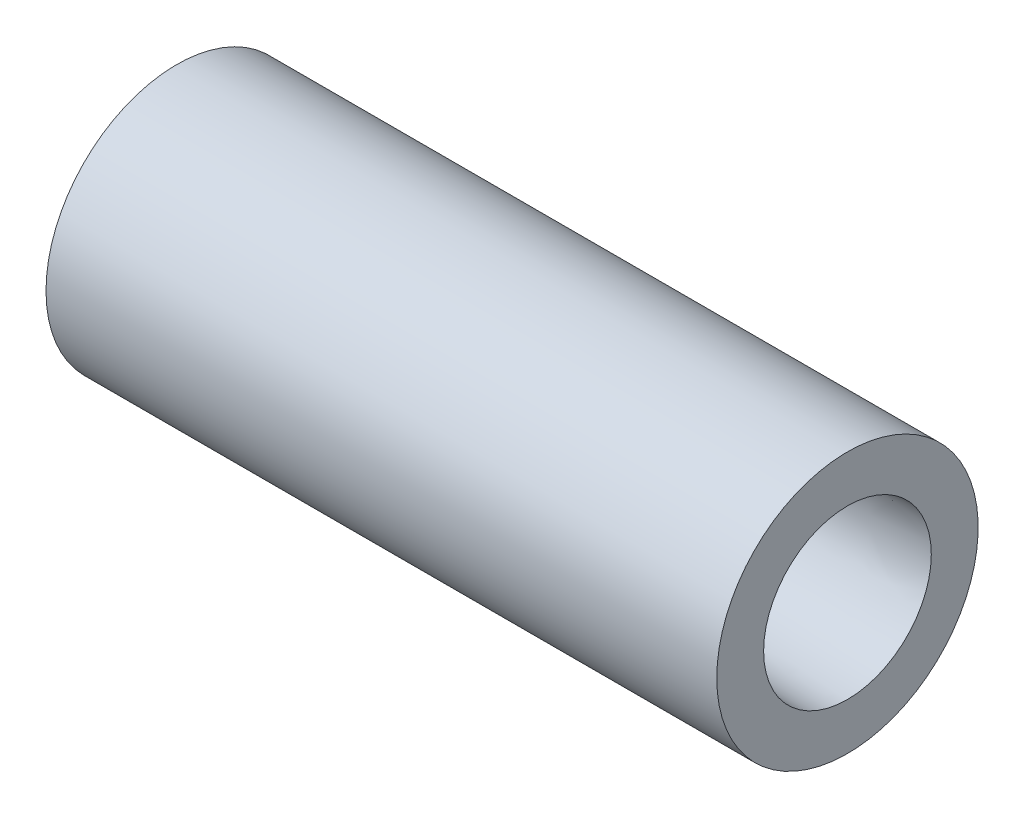
ISO-10303-21;
HEADER;
FILE_DESCRIPTION(('STEP AP214'),'2;1');
FILE_NAME('part.step','',(''),(''),'','','');
FILE_SCHEMA(('AUTOMOTIVE_DESIGN { 1 0 10303 214 1 1 1 1 }'));
ENDSEC;
DATA;
#1=APPLICATION_CONTEXT('core data for automotive mechanical design processes');
#2=APPLICATION_PROTOCOL_DEFINITION('international standard','automotive_design',2000,#1);
#3=PRODUCT_CONTEXT('',#1,'mechanical');
#4=PRODUCT('Part','Part','',(#3));
#5=PRODUCT_RELATED_PRODUCT_CATEGORY('part','',(#4));
#6=PRODUCT_DEFINITION_FORMATION('','',#4);
#7=PRODUCT_DEFINITION_CONTEXT('part definition',#1,'design');
#8=PRODUCT_DEFINITION('design','',#6,#7);
#9=PRODUCT_DEFINITION_SHAPE('','',#8);
#10=(LENGTH_UNIT() NAMED_UNIT(*) SI_UNIT(.MILLI.,.METRE.));
#11=(NAMED_UNIT(*) PLANE_ANGLE_UNIT() SI_UNIT($,.RADIAN.));
#12=(NAMED_UNIT(*) SI_UNIT($,.STERADIAN.) SOLID_ANGLE_UNIT());
#13=UNCERTAINTY_MEASURE_WITH_UNIT(LENGTH_MEASURE(1.E-05),#10,'distance_accuracy_value','');
#14=(GEOMETRIC_REPRESENTATION_CONTEXT(3) GLOBAL_UNCERTAINTY_ASSIGNED_CONTEXT((#13)) GLOBAL_UNIT_ASSIGNED_CONTEXT((#10,
#11,#12)) REPRESENTATION_CONTEXT('',''));
#15=CARTESIAN_POINT('',(0.,0.,0.));
#16=DIRECTION('',(0.,0.,1.));
#17=DIRECTION('',(1.,0.,0.));
#18=AXIS2_PLACEMENT_3D('',#15,#16,#17);
#19=CARTESIAN_POINT('',(0.,3.57919492866018,0.));
#20=CARTESIAN_POINT('',(0.892455539825838,3.54828447571399,0.));
#21=CARTESIAN_POINT('',(1.7895974646655,3.57919492867174,0.));
#22=CARTESIAN_POINT('',(2.01399854817555,3.58692652491472,0.));
#23=CARTESIAN_POINT('',(2.23832509892343,3.59658170438057,0.));
#24=CARTESIAN_POINT('',(2.46228028572995,3.60622090006969,0.));
#25=CARTESIAN_POINT('',(2.68688793006578,3.61010023682081,0.));
#26=CARTESIAN_POINT('',(3.19889941405274,3.61894350202977,0.));
#27=CARTESIAN_POINT('',(3.57919492860086,3.57919492866638,0.));
#28=B_SPLINE_CURVE_WITH_KNOTS('',2,(#19,#20,#21,#22,#23,#24,#25,#26,#27),.UNSPECIFIED.,.F.,.F.,
(3,2,2,2,3),(0.,0.5,0.625,0.75,1.),.UNSPECIFIED.);
#29=CARTESIAN_POINT('',(0.,0.,0.));
#30=DIRECTION('',(-1.,0.,0.));
#31=AXIS1_PLACEMENT('',#29,#30);
#32=SURFACE_OF_REVOLUTION('',#28,#31);
#33=CARTESIAN_POINT('',(3.57919492860086,0.,0.));
#34=DIRECTION('',(-1.,0.,0.));
#35=DIRECTION('',(0.,0.,1.));
#36=AXIS2_PLACEMENT_3D('',#33,#34,#35);
#37=CIRCLE('',#36,3.57919492866638);
#38=CARTESIAN_POINT('',(3.57919492860086,0.,3.57919492866638));
#39=VERTEX_POINT('',#38);
#40=EDGE_CURVE('E73',#39,#39,#37,.T.);
#41=ORIENTED_EDGE('',*,*,#40,.F.);
#42=EDGE_LOOP('',(#41));
#43=FACE_BOUND('',#42,.T.);
#44=CARTESIAN_POINT('',(0.,0.,0.));
#45=DIRECTION('',(-1.,0.,0.));
#46=DIRECTION('',(0.,0.,1.));
#47=AXIS2_PLACEMENT_3D('',#44,#45,#46);
#48=CIRCLE('',#47,3.57919492866018);
#49=CARTESIAN_POINT('',(0.,0.,3.57919492866018));
#50=VERTEX_POINT('',#49);
#51=EDGE_CURVE('E10',#50,#50,#48,.T.);
#52=ORIENTED_EDGE('',*,*,#51,.T.);
#53=EDGE_LOOP('',(#52));
#54=FACE_BOUND('',#53,.T.);
#55=ADVANCED_FACE('F37',(#43,#54),#32,.T.);
#56=CARTESIAN_POINT('',(0.,3.57919492866018,0.));
#57=DIRECTION('',(1.,0.,0.));
#58=DIRECTION('',(0.,0.,-1.));
#59=AXIS2_PLACEMENT_3D('',#56,#57,#58);
#60=PLANE('',#59);
#61=ORIENTED_EDGE('',*,*,#51,.F.);
#62=EDGE_LOOP('',(#61));
#63=FACE_BOUND('',#62,.T.);
#64=CARTESIAN_POINT('',(0.,0.,0.));
#65=DIRECTION('',(-1.,0.,0.));
#66=DIRECTION('',(0.,0.,1.));
#67=AXIS2_PLACEMENT_3D('',#64,#65,#66);
#68=CIRCLE('',#67,5.57919492866018);
#69=CARTESIAN_POINT('',(0.,0.,5.57919492866018));
#70=VERTEX_POINT('',#69);
#71=EDGE_CURVE('E45',#70,#70,#68,.T.);
#72=ORIENTED_EDGE('',*,*,#71,.T.);
#73=EDGE_LOOP('',(#72));
#74=FACE_BOUND('',#73,.T.);
#75=ADVANCED_FACE('F102',(#63,#74),#60,.F.);
#76=CARTESIAN_POINT('',(0.,0.,0.));
#77=DIRECTION('',(-1.,0.,0.));
#78=DIRECTION('',(0.,0.,1.));
#79=AXIS2_PLACEMENT_3D('',#76,#77,#78);
#80=CYLINDRICAL_SURFACE('',#79,5.57919492866018);
#81=ORIENTED_EDGE('',*,*,#71,.F.);
#82=EDGE_LOOP('',(#81));
#83=FACE_BOUND('',#82,.T.);
#84=CARTESIAN_POINT('',(28.6335594292815,0.,0.));
#85=DIRECTION('',(-1.,0.,0.));
#86=DIRECTION('',(0.,0.,1.));
#87=AXIS2_PLACEMENT_3D('',#84,#85,#86);
#88=CIRCLE('',#87,5.57919492866018);
#89=CARTESIAN_POINT('',(28.6335594292815,0.,5.57919492866018));
#90=VERTEX_POINT('',#89);
#91=EDGE_CURVE('E50',#90,#90,#88,.T.);
#92=ORIENTED_EDGE('',*,*,#91,.T.);
#93=EDGE_LOOP('',(#92));
#94=FACE_BOUND('',#93,.T.);
#95=ADVANCED_FACE('F99',(#83,#94),#80,.T.);
#96=CARTESIAN_POINT('',(28.6335594292815,5.57919492866018,0.));
#97=DIRECTION('',(-1.,0.,0.));
#98=DIRECTION('',(0.,0.,1.));
#99=AXIS2_PLACEMENT_3D('',#96,#97,#98);
#100=PLANE('',#99);
#101=ORIENTED_EDGE('',*,*,#91,.F.);
#102=EDGE_LOOP('',(#101));
#103=FACE_BOUND('',#102,.T.);
#104=CARTESIAN_POINT('',(28.6335594292815,0.,0.));
#105=DIRECTION('',(-1.,0.,0.));
#106=DIRECTION('',(0.,0.,1.));
#107=AXIS2_PLACEMENT_3D('',#104,#105,#106);
#108=CIRCLE('',#107,3.57919492866018);
#109=CARTESIAN_POINT('',(28.6335594292815,0.,3.57919492866018));
#110=VERTEX_POINT('',#109);
#111=EDGE_CURVE('E55',#110,#110,#108,.T.);
#112=ORIENTED_EDGE('',*,*,#111,.T.);
#113=EDGE_LOOP('',(#112));
#114=FACE_BOUND('',#113,.T.);
#115=ADVANCED_FACE('F94',(#103,#114),#100,.F.);
#116=CARTESIAN_POINT('',(17.8959746433009,2.95283581614465,0.));
#117=CARTESIAN_POINT('',(18.9726611873012,3.04911963563565,0.));
#118=CARTESIAN_POINT('',(20.5771681860868,3.16004907763778,0.));
#119=CARTESIAN_POINT('',(22.1680904906439,3.27003932613583,0.));
#120=CARTESIAN_POINT('',(23.260655716,3.33968472682989,0.));
#121=CARTESIAN_POINT('',(24.7485215325462,3.4345285023478,0.));
#122=CARTESIAN_POINT('',(25.9457474698491,3.48839129300816,0.));
#123=CARTESIAN_POINT('',(27.2888380936479,3.54881648666087,0.));
#124=CARTESIAN_POINT('',(28.6335594292815,3.57919492866018,0.));
#125=B_SPLINE_CURVE_WITH_KNOTS('',2,(#116,#117,#118,#119,#120,#121,#122,#123,#124),
.UNSPECIFIED.,.F.,.F.,(3,2,2,2,3),(0.,0.25,0.5,0.75,1.),.UNSPECIFIED.);
#126=CARTESIAN_POINT('',(0.,0.,0.));
#127=DIRECTION('',(-1.,0.,0.));
#128=AXIS1_PLACEMENT('',#126,#127);
#129=SURFACE_OF_REVOLUTION('',#125,#128);
#130=ORIENTED_EDGE('',*,*,#111,.F.);
#131=EDGE_LOOP('',(#130));
#132=FACE_BOUND('',#131,.T.);
#133=CARTESIAN_POINT('',(17.8959746433009,0.,0.));
#134=DIRECTION('',(-1.,0.,0.));
#135=DIRECTION('',(0.,0.,1.));
#136=AXIS2_PLACEMENT_3D('',#133,#134,#135);
#137=CIRCLE('',#136,2.95283581614465);
#138=CARTESIAN_POINT('',(17.8959746433009,0.,2.95283581614465));
#139=VERTEX_POINT('',#138);
#140=EDGE_CURVE('E61',#139,#139,#137,.T.);
#141=ORIENTED_EDGE('',*,*,#140,.T.);
#142=EDGE_LOOP('',(#141));
#143=FACE_BOUND('',#142,.T.);
#144=ADVANCED_FACE('F89',(#132,#143),#129,.T.);
#145=CARTESIAN_POINT('',(10.7375847858938,2.1922568937868,0.));
#146=CARTESIAN_POINT('',(11.1287732696499,2.27151902537627,0.));
#147=CARTESIAN_POINT('',(11.6298309443313,2.32880846856264,0.));
#148=CARTESIAN_POINT('',(11.872051374148,2.35650323156848,0.));
#149=CARTESIAN_POINT('',(12.5234544678337,2.41561819376425,0.));
#150=CARTESIAN_POINT('',(13.2797190394348,2.48424935624038,0.));
#151=CARTESIAN_POINT('',(14.3140008008862,2.59083561588357,0.));
#152=CARTESIAN_POINT('',(15.2096382816357,2.68313410999545,0.));
#153=CARTESIAN_POINT('',(16.105027851564,2.77780737444972,0.));
#154=CARTESIAN_POINT('',(17.016914526647,2.87422494646742,0.));
#155=CARTESIAN_POINT('',(17.8959746433009,2.95283581614465,0.));
#156=B_SPLINE_CURVE_WITH_KNOTS('',2,(#145,#146,#147,#148,#149,#150,#151,#152,#153,#154,#155),
.UNSPECIFIED.,.F.,.F.,(3,2,2,2,2,3),(0.,0.125,0.25,0.5,0.75,1.),.UNSPECIFIED.);
#157=CARTESIAN_POINT('',(0.,0.,0.));
#158=DIRECTION('',(-1.,0.,0.));
#159=AXIS1_PLACEMENT('',#157,#158);
#160=SURFACE_OF_REVOLUTION('',#156,#159);
#161=ORIENTED_EDGE('',*,*,#140,.F.);
#162=EDGE_LOOP('',(#161));
#163=FACE_BOUND('',#162,.T.);
#164=CARTESIAN_POINT('',(10.7375847858938,0.,0.));
#165=DIRECTION('',(-1.,0.,0.));
#166=DIRECTION('',(0.,0.,1.));
#167=AXIS2_PLACEMENT_3D('',#164,#165,#166);
#168=CIRCLE('',#167,2.1922568937868);
#169=CARTESIAN_POINT('',(10.7375847858938,0.,2.1922568937868));
#170=VERTEX_POINT('',#169);
#171=EDGE_CURVE('E65',#170,#170,#168,.T.);
#172=ORIENTED_EDGE('',*,*,#171,.T.);
#173=EDGE_LOOP('',(#172));
#174=FACE_BOUND('',#173,.T.);
#175=ADVANCED_FACE('F93',(#163,#174),#160,.T.);
#176=CARTESIAN_POINT('',(8.9479873174522,2.23699683160193,0.));
#177=CARTESIAN_POINT('',(9.17239808547961,2.17342404168574,0.));
#178=CARTESIAN_POINT('',(9.24367609211684,2.15475817380344,0.));
#179=CARTESIAN_POINT('',(9.3231244191715,2.13395271015152,0.));
#180=CARTESIAN_POINT('',(9.39206937168808,2.11836433784292,0.));
#181=CARTESIAN_POINT('',(9.64165640686219,2.06193300406605,0.));
#182=CARTESIAN_POINT('',(9.83898481779813,2.0581051527345,0.));
#183=CARTESIAN_POINT('',(10.0299225236354,2.05440127072346,0.));
#184=CARTESIAN_POINT('',(10.2877491615825,2.10023922620199,0.));
#185=CARTESIAN_POINT('',(10.3759277253251,2.11591613651343,0.));
#186=CARTESIAN_POINT('',(10.512578348961,2.14484162163177,0.));
#187=CARTESIAN_POINT('',(10.714074676151,2.18749330413757,0.));
#188=CARTESIAN_POINT('',(10.7375847858938,2.1922568937868,0.));
#189=B_SPLINE_CURVE_WITH_KNOTS('',2,(#176,#177,#178,#179,#180,#181,#182,#183,#184,#185,#186,
#187,#188),.UNSPECIFIED.,.F.,.F.,(3,2,2,2,2,2,3),(0.,0.166666666666667,0.25,0.5,0.75,0.875,1.),.UNSPECIFIED.);
#190=CARTESIAN_POINT('',(0.,0.,0.));
#191=DIRECTION('',(-1.,0.,0.));
#192=AXIS1_PLACEMENT('',#190,#191);
#193=SURFACE_OF_REVOLUTION('',#189,#192);
#194=ORIENTED_EDGE('',*,*,#171,.F.);
#195=EDGE_LOOP('',(#194));
#196=FACE_BOUND('',#195,.T.);
#197=CARTESIAN_POINT('',(8.9479873174522,0.,0.));
#198=DIRECTION('',(-1.,0.,0.));
#199=DIRECTION('',(0.,0.,1.));
#200=AXIS2_PLACEMENT_3D('',#197,#198,#199);
#201=CIRCLE('',#200,2.23699683160193);
#202=CARTESIAN_POINT('',(8.9479873174522,0.,2.23699683160193));
#203=VERTEX_POINT('',#202);
#204=EDGE_CURVE('E69',#203,#203,#201,.T.);
#205=ORIENTED_EDGE('',*,*,#204,.T.);
#206=EDGE_LOOP('',(#205));
#207=FACE_BOUND('',#206,.T.);
#208=ADVANCED_FACE('F116',(#196,#207),#193,.T.);
#209=CARTESIAN_POINT('',(3.57919492860086,3.57919492866638,0.));
#210=CARTESIAN_POINT('',(3.88894747873105,3.54681952193046,0.));
#211=CARTESIAN_POINT('',(4.26122616273039,3.468295670472,0.));
#212=CARTESIAN_POINT('',(4.52341141076982,3.4129935638607,0.));
#213=CARTESIAN_POINT('',(4.93619095449896,3.30695639871521,0.));
#214=CARTESIAN_POINT('',(5.29658668105142,3.21437588750835,0.));
#215=CARTESIAN_POINT('',(6.27340154395885,2.95018228213502,0.));
#216=CARTESIAN_POINT('',(7.03899358319577,2.74311692228874,0.));
#217=CARTESIAN_POINT('',(7.61068986889164,2.59363485304665,0.));
#218=CARTESIAN_POINT('',(7.94421318642718,2.50642813701033,0.));
#219=CARTESIAN_POINT('',(8.27778261219794,2.41939795343784,0.));
#220=CARTESIAN_POINT('',(8.61106900151044,2.33244161570678,0.));
#221=CARTESIAN_POINT('',(8.9479873174522,2.23699683160193,0.));
#222=B_SPLINE_CURVE_WITH_KNOTS('',2,(#209,#210,#211,#212,#213,#214,#215,#216,#217,#218,#219,
#220,#221),.UNSPECIFIED.,.F.,.F.,(3,2,2,2,2,2,3),(0.,0.125,0.25,0.5,0.75,0.875,1.),.UNSPECIFIED.);
#223=CARTESIAN_POINT('',(0.,0.,0.));
#224=DIRECTION('',(-1.,0.,0.));
#225=AXIS1_PLACEMENT('',#223,#224);
#226=SURFACE_OF_REVOLUTION('',#222,#225);
#227=ORIENTED_EDGE('',*,*,#204,.F.);
#228=EDGE_LOOP('',(#227));
#229=FACE_BOUND('',#228,.T.);
#230=ORIENTED_EDGE('',*,*,#40,.T.);
#231=EDGE_LOOP('',(#230));
#232=FACE_BOUND('',#231,.T.);
#233=ADVANCED_FACE('F114',(#229,#232),#226,.T.);
#234=CLOSED_SHELL('',(#55,#75,#95,#115,#144,#175,#208,#233));
#235=MANIFOLD_SOLID_BREP('B2',#234);
#236=ADVANCED_BREP_SHAPE_REPRESENTATION('',(#18,#235),#14);
#237=SHAPE_DEFINITION_REPRESENTATION(#9,#236);
ENDSEC;
END-ISO-10303-21;
